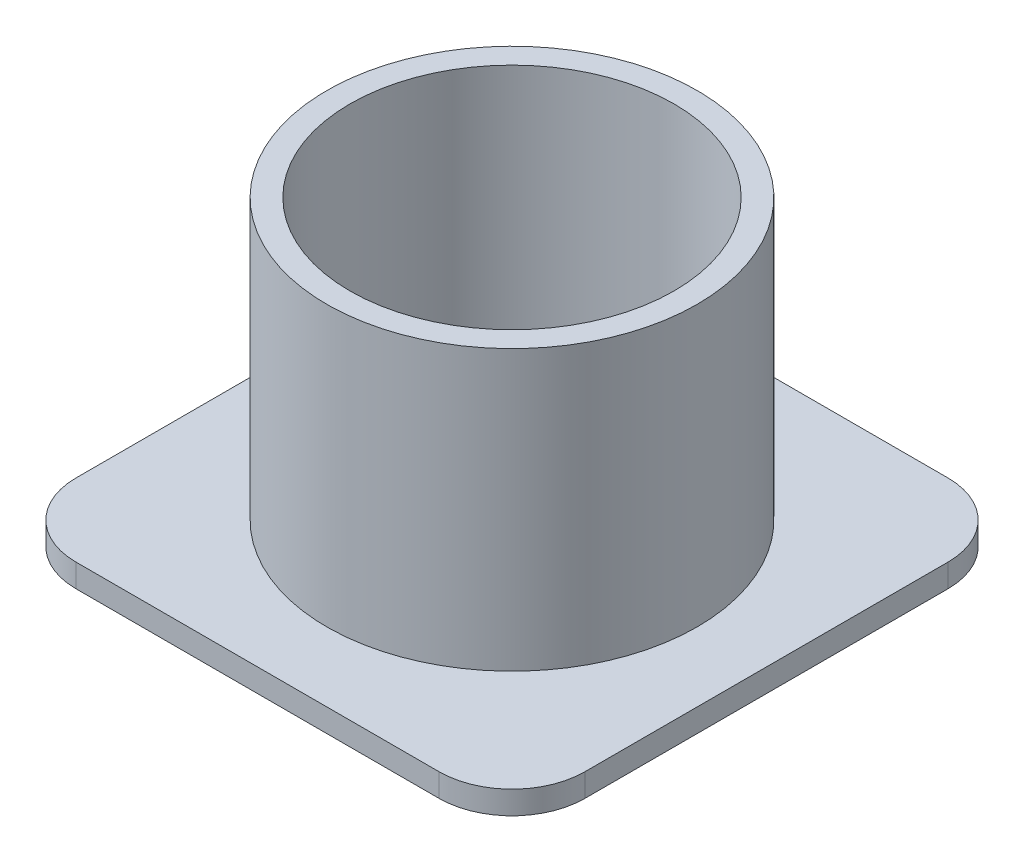
ISO-10303-21;
HEADER;
FILE_DESCRIPTION(('STEP AP214'),'2;1');
FILE_NAME('part.step','',(''),(''),'','','');
FILE_SCHEMA(('AUTOMOTIVE_DESIGN { 1 0 10303 214 1 1 1 1 }'));
ENDSEC;
DATA;
#1=APPLICATION_CONTEXT('core data for automotive mechanical design processes');
#2=APPLICATION_PROTOCOL_DEFINITION('international standard','automotive_design',2000,#1);
#3=PRODUCT_CONTEXT('',#1,'mechanical');
#4=PRODUCT('Part','Part','',(#3));
#5=PRODUCT_RELATED_PRODUCT_CATEGORY('part','',(#4));
#6=PRODUCT_DEFINITION_FORMATION('','',#4);
#7=PRODUCT_DEFINITION_CONTEXT('part definition',#1,'design');
#8=PRODUCT_DEFINITION('design','',#6,#7);
#9=PRODUCT_DEFINITION_SHAPE('','',#8);
#10=(LENGTH_UNIT() NAMED_UNIT(*) SI_UNIT(.MILLI.,.METRE.));
#11=(NAMED_UNIT(*) PLANE_ANGLE_UNIT() SI_UNIT($,.RADIAN.));
#12=(NAMED_UNIT(*) SI_UNIT($,.STERADIAN.) SOLID_ANGLE_UNIT());
#13=UNCERTAINTY_MEASURE_WITH_UNIT(LENGTH_MEASURE(1.E-05),#10,'distance_accuracy_value','');
#14=(GEOMETRIC_REPRESENTATION_CONTEXT(3) GLOBAL_UNCERTAINTY_ASSIGNED_CONTEXT((#13)) GLOBAL_UNIT_ASSIGNED_CONTEXT((#10,
#11,#12)) REPRESENTATION_CONTEXT('',''));
#15=CARTESIAN_POINT('',(0.,0.,0.));
#16=DIRECTION('',(0.,0.,1.));
#17=DIRECTION('',(1.,0.,0.));
#18=AXIS2_PLACEMENT_3D('',#15,#16,#17);
#19=CARTESIAN_POINT('',(-24.925,3.175,24.925));
#20=DIRECTION('',(0.,1.,0.));
#21=DIRECTION('',(0.,0.,1.));
#22=AXIS2_PLACEMENT_3D('',#19,#20,#21);
#23=PLANE('',#22);
#24=CARTESIAN_POINT('',(-24.925,3.175,24.925));
#25=DIRECTION('',(0.,1.,0.));
#26=DIRECTION('',(0.,0.,1.));
#27=AXIS2_PLACEMENT_3D('',#24,#25,#26);
#28=CIRCLE('',#27,10.);
#29=CARTESIAN_POINT('',(-34.925,3.175,24.925));
#30=VERTEX_POINT('',#29);
#31=CARTESIAN_POINT('',(-24.925,3.175,34.925));
#32=VERTEX_POINT('',#31);
#33=EDGE_CURVE('E150',#30,#32,#28,.T.);
#34=ORIENTED_EDGE('',*,*,#33,.T.);
#35=DIRECTION('',(1.,0.,0.));
#36=VECTOR('',#35,1.);
#37=CARTESIAN_POINT('',(-24.925,3.175,34.925));
#38=LINE('',#37,#36);
#39=CARTESIAN_POINT('',(24.925,3.175,34.925));
#40=VERTEX_POINT('',#39);
#41=EDGE_CURVE('E99',#32,#40,#38,.T.);
#42=ORIENTED_EDGE('',*,*,#41,.T.);
#43=CARTESIAN_POINT('',(24.925,3.175,24.925));
#44=DIRECTION('',(0.,1.,0.));
#45=DIRECTION('',(0.,0.,1.));
#46=AXIS2_PLACEMENT_3D('',#43,#44,#45);
#47=CIRCLE('',#46,10.);
#48=CARTESIAN_POINT('',(34.925,3.175,24.925));
#49=VERTEX_POINT('',#48);
#50=EDGE_CURVE('E166',#40,#49,#47,.T.);
#51=ORIENTED_EDGE('',*,*,#50,.T.);
#52=DIRECTION('',(0.,0.,-1.));
#53=VECTOR('',#52,1.);
#54=CARTESIAN_POINT('',(34.925,3.175,-24.925));
#55=LINE('',#54,#53);
#56=CARTESIAN_POINT('',(34.925,3.175,-24.925));
#57=VERTEX_POINT('',#56);
#58=EDGE_CURVE('E178',#49,#57,#55,.T.);
#59=ORIENTED_EDGE('',*,*,#58,.T.);
#60=CARTESIAN_POINT('',(24.925,3.175,-24.925));
#61=DIRECTION('',(0.,1.,0.));
#62=DIRECTION('',(0.,0.,-1.));
#63=AXIS2_PLACEMENT_3D('',#60,#61,#62);
#64=CIRCLE('',#63,10.);
#65=CARTESIAN_POINT('',(24.925,3.175,-34.925));
#66=VERTEX_POINT('',#65);
#67=EDGE_CURVE('E118',#57,#66,#64,.T.);
#68=ORIENTED_EDGE('',*,*,#67,.T.);
#69=DIRECTION('',(-1.,0.,0.));
#70=VECTOR('',#69,1.);
#71=CARTESIAN_POINT('',(-24.925,3.175,-34.925));
#72=LINE('',#71,#70);
#73=CARTESIAN_POINT('',(-24.925,3.175,-34.925));
#74=VERTEX_POINT('',#73);
#75=EDGE_CURVE('E112',#66,#74,#72,.T.);
#76=ORIENTED_EDGE('',*,*,#75,.T.);
#77=CARTESIAN_POINT('',(-24.925,3.175,-24.925));
#78=DIRECTION('',(0.,1.,0.));
#79=DIRECTION('',(0.,0.,1.));
#80=AXIS2_PLACEMENT_3D('',#77,#78,#79);
#81=CIRCLE('',#80,10.);
#82=CARTESIAN_POINT('',(-34.925,3.175,-24.925));
#83=VERTEX_POINT('',#82);
#84=EDGE_CURVE('E116',#74,#83,#81,.T.);
#85=ORIENTED_EDGE('',*,*,#84,.T.);
#86=DIRECTION('',(0.,0.,1.));
#87=VECTOR('',#86,1.);
#88=CARTESIAN_POINT('',(-34.925,3.175,-24.925));
#89=LINE('',#88,#87);
#90=EDGE_CURVE('E56',#83,#30,#89,.T.);
#91=ORIENTED_EDGE('',*,*,#90,.T.);
#92=EDGE_LOOP('',(#34,#42,#51,#59,#68,#76,#85,#91));
#93=FACE_BOUND('',#92,.T.);
#94=CARTESIAN_POINT('',(0.,3.175,0.));
#95=DIRECTION('',(0.,1.,0.));
#96=DIRECTION('',(1.,0.,0.));
#97=AXIS2_PLACEMENT_3D('',#94,#95,#96);
#98=CIRCLE('',#97,25.4201139777684);
#99=CARTESIAN_POINT('',(25.4201139777684,3.175,0.));
#100=VERTEX_POINT('',#99);
#101=EDGE_CURVE('E184',#100,#100,#98,.T.);
#102=ORIENTED_EDGE('',*,*,#101,.F.);
#103=EDGE_LOOP('',(#102));
#104=FACE_BOUND('',#103,.T.);
#105=ADVANCED_FACE('F38',(#93,#104),#23,.T.);
#106=CARTESIAN_POINT('',(-24.925,3.175,24.925));
#107=DIRECTION('',(0.,-1.,0.));
#108=DIRECTION('',(0.,0.,-1.));
#109=AXIS2_PLACEMENT_3D('',#106,#107,#108);
#110=CYLINDRICAL_SURFACE('',#109,10.);
#111=CARTESIAN_POINT('',(-24.925,0.,24.925));
#112=DIRECTION('',(0.,1.,0.));
#113=DIRECTION('',(0.,0.,1.));
#114=AXIS2_PLACEMENT_3D('',#111,#112,#113);
#115=CIRCLE('',#114,10.);
#116=CARTESIAN_POINT('',(-34.925,0.,24.925));
#117=VERTEX_POINT('',#116);
#118=CARTESIAN_POINT('',(-24.925,0.,34.925));
#119=VERTEX_POINT('',#118);
#120=EDGE_CURVE('E136',#117,#119,#115,.T.);
#121=ORIENTED_EDGE('',*,*,#120,.T.);
#122=DIRECTION('',(0.,-1.,0.));
#123=VECTOR('',#122,1.);
#124=CARTESIAN_POINT('',(-24.925,3.175,34.925));
#125=LINE('',#124,#123);
#126=EDGE_CURVE('E12',#32,#119,#125,.T.);
#127=ORIENTED_EDGE('',*,*,#126,.F.);
#128=ORIENTED_EDGE('',*,*,#33,.F.);
#129=DIRECTION('',(0.,-1.,0.));
#130=VECTOR('',#129,1.);
#131=CARTESIAN_POINT('',(-34.925,3.175,24.925));
#132=LINE('',#131,#130);
#133=EDGE_CURVE('E132',#30,#117,#132,.T.);
#134=ORIENTED_EDGE('',*,*,#133,.T.);
#135=EDGE_LOOP('',(#121,#127,#128,#134));
#136=FACE_BOUND('',#135,.T.);
#137=ADVANCED_FACE('F40',(#136),#110,.T.);
#138=CARTESIAN_POINT('',(-24.925,3.175,34.925));
#139=DIRECTION('',(0.,0.,-1.));
#140=DIRECTION('',(-1.,0.,0.));
#141=AXIS2_PLACEMENT_3D('',#138,#139,#140);
#142=PLANE('',#141);
#143=DIRECTION('',(1.,0.,0.));
#144=VECTOR('',#143,1.);
#145=CARTESIAN_POINT('',(-24.925,0.,34.925));
#146=LINE('',#145,#144);
#147=CARTESIAN_POINT('',(24.925,0.,34.925));
#148=VERTEX_POINT('',#147);
#149=EDGE_CURVE('E139',#119,#148,#146,.T.);
#150=ORIENTED_EDGE('',*,*,#149,.T.);
#151=DIRECTION('',(0.,-1.,0.));
#152=VECTOR('',#151,1.);
#153=CARTESIAN_POINT('',(24.925,3.175,34.925));
#154=LINE('',#153,#152);
#155=EDGE_CURVE('E48',#40,#148,#154,.T.);
#156=ORIENTED_EDGE('',*,*,#155,.F.);
#157=ORIENTED_EDGE('',*,*,#41,.F.);
#158=ORIENTED_EDGE('',*,*,#126,.T.);
#159=EDGE_LOOP('',(#150,#156,#157,#158));
#160=FACE_BOUND('',#159,.T.);
#161=ADVANCED_FACE('F214',(#160),#142,.F.);
#162=CARTESIAN_POINT('',(24.925,3.175,24.925));
#163=DIRECTION('',(0.,-1.,0.));
#164=DIRECTION('',(0.,0.,-1.));
#165=AXIS2_PLACEMENT_3D('',#162,#163,#164);
#166=CYLINDRICAL_SURFACE('',#165,10.);
#167=CARTESIAN_POINT('',(24.925,0.,24.925));
#168=DIRECTION('',(0.,1.,0.));
#169=DIRECTION('',(0.,0.,1.));
#170=AXIS2_PLACEMENT_3D('',#167,#168,#169);
#171=CIRCLE('',#170,10.);
#172=CARTESIAN_POINT('',(34.925,0.,24.925));
#173=VERTEX_POINT('',#172);
#174=EDGE_CURVE('E141',#148,#173,#171,.T.);
#175=ORIENTED_EDGE('',*,*,#174,.T.);
#176=DIRECTION('',(0.,-1.,0.));
#177=VECTOR('',#176,1.);
#178=CARTESIAN_POINT('',(34.925,3.175,24.925));
#179=LINE('',#178,#177);
#180=EDGE_CURVE('E157',#49,#173,#179,.T.);
#181=ORIENTED_EDGE('',*,*,#180,.F.);
#182=ORIENTED_EDGE('',*,*,#50,.F.);
#183=ORIENTED_EDGE('',*,*,#155,.T.);
#184=EDGE_LOOP('',(#175,#181,#182,#183));
#185=FACE_BOUND('',#184,.T.);
#186=ADVANCED_FACE('F164',(#185),#166,.T.);
#187=CARTESIAN_POINT('',(34.925,3.175,-24.925));
#188=DIRECTION('',(-1.,0.,0.));
#189=DIRECTION('',(0.,0.,1.));
#190=AXIS2_PLACEMENT_3D('',#187,#188,#189);
#191=PLANE('',#190);
#192=DIRECTION('',(0.,0.,-1.));
#193=VECTOR('',#192,1.);
#194=CARTESIAN_POINT('',(34.925,0.,-24.925));
#195=LINE('',#194,#193);
#196=CARTESIAN_POINT('',(34.925,0.,-24.925));
#197=VERTEX_POINT('',#196);
#198=EDGE_CURVE('E143',#173,#197,#195,.T.);
#199=ORIENTED_EDGE('',*,*,#198,.T.);
#200=DIRECTION('',(0.,-1.,0.));
#201=VECTOR('',#200,1.);
#202=CARTESIAN_POINT('',(34.925,3.175,-24.925));
#203=LINE('',#202,#201);
#204=EDGE_CURVE('E154',#57,#197,#203,.T.);
#205=ORIENTED_EDGE('',*,*,#204,.F.);
#206=ORIENTED_EDGE('',*,*,#58,.F.);
#207=ORIENTED_EDGE('',*,*,#180,.T.);
#208=EDGE_LOOP('',(#199,#205,#206,#207));
#209=FACE_BOUND('',#208,.T.);
#210=ADVANCED_FACE('F174',(#209),#191,.F.);
#211=CARTESIAN_POINT('',(24.925,3.175,-24.925));
#212=DIRECTION('',(0.,-1.,0.));
#213=DIRECTION('',(0.,0.,-1.));
#214=AXIS2_PLACEMENT_3D('',#211,#212,#213);
#215=CYLINDRICAL_SURFACE('',#214,10.);
#216=CARTESIAN_POINT('',(24.925,0.,-24.925));
#217=DIRECTION('',(0.,1.,0.));
#218=DIRECTION('',(0.,0.,-1.));
#219=AXIS2_PLACEMENT_3D('',#216,#217,#218);
#220=CIRCLE('',#219,10.);
#221=CARTESIAN_POINT('',(24.925,0.,-34.925));
#222=VERTEX_POINT('',#221);
#223=EDGE_CURVE('E145',#197,#222,#220,.T.);
#224=ORIENTED_EDGE('',*,*,#223,.T.);
#225=DIRECTION('',(0.,-1.,0.));
#226=VECTOR('',#225,1.);
#227=CARTESIAN_POINT('',(24.925,3.175,-34.925));
#228=LINE('',#227,#226);
#229=EDGE_CURVE('E127',#66,#222,#228,.T.);
#230=ORIENTED_EDGE('',*,*,#229,.F.);
#231=ORIENTED_EDGE('',*,*,#67,.F.);
#232=ORIENTED_EDGE('',*,*,#204,.T.);
#233=EDGE_LOOP('',(#224,#230,#231,#232));
#234=FACE_BOUND('',#233,.T.);
#235=ADVANCED_FACE('F177',(#234),#215,.T.);
#236=CARTESIAN_POINT('',(-24.925,3.175,-34.925));
#237=DIRECTION('',(0.,0.,1.));
#238=DIRECTION('',(1.,0.,0.));
#239=AXIS2_PLACEMENT_3D('',#236,#237,#238);
#240=PLANE('',#239);
#241=DIRECTION('',(-1.,0.,0.));
#242=VECTOR('',#241,1.);
#243=CARTESIAN_POINT('',(-24.925,0.,-34.925));
#244=LINE('',#243,#242);
#245=CARTESIAN_POINT('',(-24.925,0.,-34.925));
#246=VERTEX_POINT('',#245);
#247=EDGE_CURVE('E126',#222,#246,#244,.T.);
#248=ORIENTED_EDGE('',*,*,#247,.T.);
#249=DIRECTION('',(0.,-1.,0.));
#250=VECTOR('',#249,1.);
#251=CARTESIAN_POINT('',(-24.925,3.175,-34.925));
#252=LINE('',#251,#250);
#253=EDGE_CURVE('E123',#74,#246,#252,.T.);
#254=ORIENTED_EDGE('',*,*,#253,.F.);
#255=ORIENTED_EDGE('',*,*,#75,.F.);
#256=ORIENTED_EDGE('',*,*,#229,.T.);
#257=EDGE_LOOP('',(#248,#254,#255,#256));
#258=FACE_BOUND('',#257,.T.);
#259=ADVANCED_FACE('F124',(#258),#240,.F.);
#260=CARTESIAN_POINT('',(-24.925,3.175,-24.925));
#261=DIRECTION('',(0.,-1.,0.));
#262=DIRECTION('',(0.,0.,-1.));
#263=AXIS2_PLACEMENT_3D('',#260,#261,#262);
#264=CYLINDRICAL_SURFACE('',#263,10.);
#265=CARTESIAN_POINT('',(-24.925,0.,-24.925));
#266=DIRECTION('',(0.,1.,0.));
#267=DIRECTION('',(0.,0.,1.));
#268=AXIS2_PLACEMENT_3D('',#265,#266,#267);
#269=CIRCLE('',#268,10.);
#270=CARTESIAN_POINT('',(-34.925,0.,-24.925));
#271=VERTEX_POINT('',#270);
#272=EDGE_CURVE('E85',#246,#271,#269,.T.);
#273=ORIENTED_EDGE('',*,*,#272,.T.);
#274=DIRECTION('',(0.,-1.,0.));
#275=VECTOR('',#274,1.);
#276=CARTESIAN_POINT('',(-34.925,3.175,-24.925));
#277=LINE('',#276,#275);
#278=EDGE_CURVE('E128',#83,#271,#277,.T.);
#279=ORIENTED_EDGE('',*,*,#278,.F.);
#280=ORIENTED_EDGE('',*,*,#84,.F.);
#281=ORIENTED_EDGE('',*,*,#253,.T.);
#282=EDGE_LOOP('',(#273,#279,#280,#281));
#283=FACE_BOUND('',#282,.T.);
#284=ADVANCED_FACE('F130',(#283),#264,.T.);
#285=CARTESIAN_POINT('',(-34.925,3.175,-24.925));
#286=DIRECTION('',(1.,0.,0.));
#287=DIRECTION('',(0.,0.,-1.));
#288=AXIS2_PLACEMENT_3D('',#285,#286,#287);
#289=PLANE('',#288);
#290=DIRECTION('',(0.,0.,1.));
#291=VECTOR('',#290,1.);
#292=CARTESIAN_POINT('',(-34.925,0.,-24.925));
#293=LINE('',#292,#291);
#294=EDGE_CURVE('E91',#271,#117,#293,.T.);
#295=ORIENTED_EDGE('',*,*,#294,.T.);
#296=ORIENTED_EDGE('',*,*,#133,.F.);
#297=ORIENTED_EDGE('',*,*,#90,.F.);
#298=ORIENTED_EDGE('',*,*,#278,.T.);
#299=EDGE_LOOP('',(#295,#296,#297,#298));
#300=FACE_BOUND('',#299,.T.);
#301=ADVANCED_FACE('F219',(#300),#289,.F.);
#302=CARTESIAN_POINT('',(-24.925,0.,24.925));
#303=DIRECTION('',(0.,1.,0.));
#304=DIRECTION('',(0.,0.,1.));
#305=AXIS2_PLACEMENT_3D('',#302,#303,#304);
#306=PLANE('',#305);
#307=CARTESIAN_POINT('',(0.,0.,0.));
#308=DIRECTION('',(0.,1.,0.));
#309=DIRECTION('',(0.,0.,1.));
#310=AXIS2_PLACEMENT_3D('',#307,#308,#309);
#311=CIRCLE('',#310,22.2451139777684);
#312=CARTESIAN_POINT('',(0.,0.,22.2451139777684));
#313=VERTEX_POINT('',#312);
#314=EDGE_CURVE('E42',#313,#313,#311,.T.);
#315=ORIENTED_EDGE('',*,*,#314,.T.);
#316=EDGE_LOOP('',(#315));
#317=FACE_BOUND('',#316,.T.);
#318=ORIENTED_EDGE('',*,*,#120,.F.);
#319=ORIENTED_EDGE('',*,*,#294,.F.);
#320=ORIENTED_EDGE('',*,*,#272,.F.);
#321=ORIENTED_EDGE('',*,*,#247,.F.);
#322=ORIENTED_EDGE('',*,*,#223,.F.);
#323=ORIENTED_EDGE('',*,*,#198,.F.);
#324=ORIENTED_EDGE('',*,*,#174,.F.);
#325=ORIENTED_EDGE('',*,*,#149,.F.);
#326=EDGE_LOOP('',(#318,#319,#320,#321,#322,#323,#324,#325));
#327=FACE_BOUND('',#326,.T.);
#328=ADVANCED_FACE('F170',(#317,#327),#306,.F.);
#329=CARTESIAN_POINT('',(0.,-3.175,0.));
#330=DIRECTION('',(0.,1.,0.));
#331=DIRECTION('',(0.,0.,1.));
#332=AXIS2_PLACEMENT_3D('',#329,#330,#331);
#333=CYLINDRICAL_SURFACE('',#332,22.2451139777684);
#334=ORIENTED_EDGE('',*,*,#314,.F.);
#335=EDGE_LOOP('',(#334));
#336=FACE_BOUND('',#335,.T.);
#337=CARTESIAN_POINT('',(0.,41.525,0.));
#338=DIRECTION('',(0.,1.,0.));
#339=DIRECTION('',(0.,0.,1.));
#340=AXIS2_PLACEMENT_3D('',#337,#338,#339);
#341=CIRCLE('',#340,22.2451139777684);
#342=CARTESIAN_POINT('',(0.,41.525,22.2451139777684));
#343=VERTEX_POINT('',#342);
#344=EDGE_CURVE('E188',#343,#343,#341,.T.);
#345=ORIENTED_EDGE('',*,*,#344,.T.);
#346=EDGE_LOOP('',(#345));
#347=FACE_BOUND('',#346,.T.);
#348=ADVANCED_FACE('F194',(#336,#347),#333,.F.);
#349=CARTESIAN_POINT('',(0.,41.525,0.));
#350=DIRECTION('',(0.,1.,0.));
#351=DIRECTION('',(0.,0.,1.));
#352=AXIS2_PLACEMENT_3D('',#349,#350,#351);
#353=PLANE('',#352);
#354=CARTESIAN_POINT('',(0.,41.525,0.));
#355=DIRECTION('',(0.,1.,0.));
#356=DIRECTION('',(1.,0.,0.));
#357=AXIS2_PLACEMENT_3D('',#354,#355,#356);
#358=CIRCLE('',#357,25.4201139777684);
#359=CARTESIAN_POINT('',(25.4201139777684,41.525,0.));
#360=VERTEX_POINT('',#359);
#361=EDGE_CURVE('E187',#360,#360,#358,.T.);
#362=ORIENTED_EDGE('',*,*,#361,.T.);
#363=EDGE_LOOP('',(#362));
#364=FACE_BOUND('',#363,.T.);
#365=ORIENTED_EDGE('',*,*,#344,.F.);
#366=EDGE_LOOP('',(#365));
#367=FACE_BOUND('',#366,.T.);
#368=ADVANCED_FACE('F196',(#364,#367),#353,.T.);
#369=CARTESIAN_POINT('',(0.,41.525,0.));
#370=DIRECTION('',(0.,-1.,0.));
#371=DIRECTION('',(0.,0.,-1.));
#372=AXIS2_PLACEMENT_3D('',#369,#370,#371);
#373=CYLINDRICAL_SURFACE('',#372,25.4201139777684);
#374=ORIENTED_EDGE('',*,*,#361,.F.);
#375=EDGE_LOOP('',(#374));
#376=FACE_BOUND('',#375,.T.);
#377=ORIENTED_EDGE('',*,*,#101,.T.);
#378=EDGE_LOOP('',(#377));
#379=FACE_BOUND('',#378,.T.);
#380=ADVANCED_FACE('F198',(#376,#379),#373,.T.);
#381=CLOSED_SHELL('',(#105,#137,#161,#186,#210,#235,#259,#284,#301,#328,#348,#368,#380));
#382=MANIFOLD_SOLID_BREP('B2',#381);
#383=ADVANCED_BREP_SHAPE_REPRESENTATION('',(#18,#382),#14);
#384=SHAPE_DEFINITION_REPRESENTATION(#9,#383);
ENDSEC;
END-ISO-10303-21;
